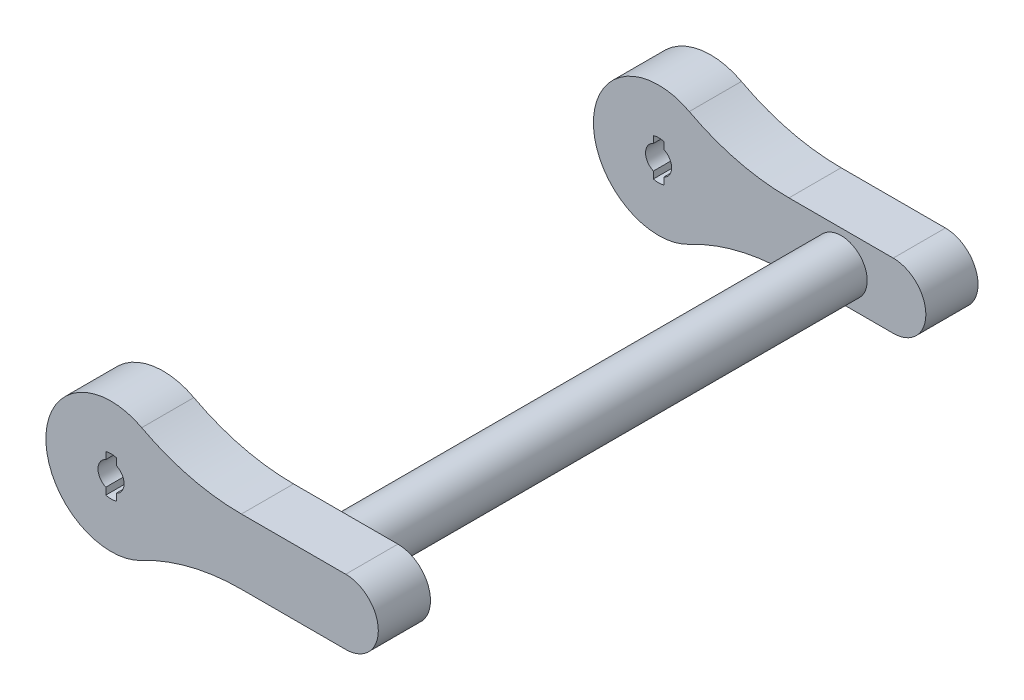
ISO-10303-21;
HEADER;
FILE_DESCRIPTION(('STEP AP214'),'2;1');
FILE_NAME('part.step','',(''),(''),'','','');
FILE_SCHEMA(('AUTOMOTIVE_DESIGN { 1 0 10303 214 1 1 1 1 }'));
ENDSEC;
DATA;
#1=APPLICATION_CONTEXT('core data for automotive mechanical design processes');
#2=APPLICATION_PROTOCOL_DEFINITION('international standard','automotive_design',2000,#1);
#3=PRODUCT_CONTEXT('',#1,'mechanical');
#4=PRODUCT('Part','Part','',(#3));
#5=PRODUCT_RELATED_PRODUCT_CATEGORY('part','',(#4));
#6=PRODUCT_DEFINITION_FORMATION('','',#4);
#7=PRODUCT_DEFINITION_CONTEXT('part definition',#1,'design');
#8=PRODUCT_DEFINITION('design','',#6,#7);
#9=PRODUCT_DEFINITION_SHAPE('','',#8);
#10=(LENGTH_UNIT() NAMED_UNIT(*) SI_UNIT(.MILLI.,.METRE.));
#11=(NAMED_UNIT(*) PLANE_ANGLE_UNIT() SI_UNIT($,.RADIAN.));
#12=(NAMED_UNIT(*) SI_UNIT($,.STERADIAN.) SOLID_ANGLE_UNIT());
#13=UNCERTAINTY_MEASURE_WITH_UNIT(LENGTH_MEASURE(1.E-05),#10,'distance_accuracy_value','');
#14=(GEOMETRIC_REPRESENTATION_CONTEXT(3) GLOBAL_UNCERTAINTY_ASSIGNED_CONTEXT((#13)) GLOBAL_UNIT_ASSIGNED_CONTEXT((#10,
#11,#12)) REPRESENTATION_CONTEXT('',''));
#15=CARTESIAN_POINT('',(0.,0.,0.));
#16=DIRECTION('',(0.,0.,1.));
#17=DIRECTION('',(1.,0.,0.));
#18=AXIS2_PLACEMENT_3D('',#15,#16,#17);
#19=CARTESIAN_POINT('',(0.,0.,-14.142135623731));
#20=DIRECTION('',(0.,0.,1.));
#21=DIRECTION('',(1.,0.,0.));
#22=AXIS2_PLACEMENT_3D('',#19,#20,#21);
#23=CYLINDRICAL_SURFACE('',#22,5.);
#24=CARTESIAN_POINT('',(0.,0.,20.));
#25=DIRECTION('',(0.,0.,1.));
#26=DIRECTION('',(1.,0.,0.));
#27=AXIS2_PLACEMENT_3D('',#24,#25,#26);
#28=CIRCLE('',#27,5.);
#29=CARTESIAN_POINT('',(2.,-4.58257569495584,20.));
#30=VERTEX_POINT('',#29);
#31=CARTESIAN_POINT('',(2.,4.58257569495584,20.));
#32=VERTEX_POINT('',#31);
#33=EDGE_CURVE('E430',#30,#32,#28,.T.);
#34=ORIENTED_EDGE('',*,*,#33,.T.);
#35=DIRECTION('',(0.,0.,1.));
#36=VECTOR('',#35,1.);
#37=CARTESIAN_POINT('',(2.,4.58257569495584,-14.142135623731));
#38=LINE('',#37,#36);
#39=CARTESIAN_POINT('',(2.,4.58257569495584,0.));
#40=VERTEX_POINT('',#39);
#41=EDGE_CURVE('E11',#32,#40,#38,.F.);
#42=ORIENTED_EDGE('',*,*,#41,.T.);
#43=CARTESIAN_POINT('',(0.,0.,0.));
#44=DIRECTION('',(0.,0.,1.));
#45=DIRECTION('',(1.,0.,0.));
#46=AXIS2_PLACEMENT_3D('',#43,#44,#45);
#47=CIRCLE('',#46,5.);
#48=CARTESIAN_POINT('',(2.,-4.58257569495584,0.));
#49=VERTEX_POINT('',#48);
#50=EDGE_CURVE('E435',#40,#49,#47,.F.);
#51=ORIENTED_EDGE('',*,*,#50,.T.);
#52=DIRECTION('',(0.,0.,1.));
#53=VECTOR('',#52,1.);
#54=CARTESIAN_POINT('',(2.,-4.58257569495584,-14.142135623731));
#55=LINE('',#54,#53);
#56=EDGE_CURVE('E54',#49,#30,#55,.T.);
#57=ORIENTED_EDGE('',*,*,#56,.T.);
#58=EDGE_LOOP('',(#34,#42,#51,#57));
#59=FACE_BOUND('',#58,.T.);
#60=ADVANCED_FACE('F45',(#59),#23,.F.);
#61=CARTESIAN_POINT('',(50.,-93.7500000000001,20.));
#62=DIRECTION('',(0.,0.,-1.));
#63=DIRECTION('',(-1.,0.,0.));
#64=AXIS2_PLACEMENT_3D('',#61,#62,#63);
#65=CYLINDRICAL_SURFACE('',#64,81.2500000000001);
#66=CARTESIAN_POINT('',(50.,-93.7500000000001,0.));
#67=DIRECTION('',(0.,0.,-1.));
#68=DIRECTION('',(1.,0.,0.));
#69=AXIS2_PLACEMENT_3D('',#66,#67,#68);
#70=CIRCLE('',#69,81.2500000000001);
#71=CARTESIAN_POINT('',(11.7647058823529,-22.0588235294118,0.));
#72=VERTEX_POINT('',#71);
#73=CARTESIAN_POINT('',(50.,-12.5,0.));
#74=VERTEX_POINT('',#73);
#75=EDGE_CURVE('E461',#72,#74,#70,.T.);
#76=ORIENTED_EDGE('',*,*,#75,.T.);
#77=DIRECTION('',(0.,0.,-1.));
#78=VECTOR('',#77,1.);
#79=CARTESIAN_POINT('',(50.,-12.5,20.));
#80=LINE('',#79,#78);
#81=CARTESIAN_POINT('',(50.,-12.5,20.));
#82=VERTEX_POINT('',#81);
#83=EDGE_CURVE('E498',#82,#74,#80,.T.);
#84=ORIENTED_EDGE('',*,*,#83,.F.);
#85=CARTESIAN_POINT('',(50.,-93.7500000000001,20.));
#86=DIRECTION('',(0.,0.,-1.));
#87=DIRECTION('',(1.,0.,0.));
#88=AXIS2_PLACEMENT_3D('',#85,#86,#87);
#89=CIRCLE('',#88,81.2500000000001);
#90=CARTESIAN_POINT('',(11.7647058823529,-22.0588235294118,20.));
#91=VERTEX_POINT('',#90);
#92=EDGE_CURVE('E440',#91,#82,#89,.T.);
#93=ORIENTED_EDGE('',*,*,#92,.F.);
#94=DIRECTION('',(0.,0.,-1.));
#95=VECTOR('',#94,1.);
#96=CARTESIAN_POINT('',(11.7647058823529,-22.0588235294118,20.));
#97=LINE('',#96,#95);
#98=EDGE_CURVE('E460',#91,#72,#97,.T.);
#99=ORIENTED_EDGE('',*,*,#98,.T.);
#100=EDGE_LOOP('',(#76,#84,#93,#99));
#101=FACE_BOUND('',#100,.T.);
#102=ADVANCED_FACE('F47',(#101),#65,.F.);
#103=CARTESIAN_POINT('',(90.,-12.5,20.));
#104=DIRECTION('',(0.,1.,0.));
#105=DIRECTION('',(-1.,0.,0.));
#106=AXIS2_PLACEMENT_3D('',#103,#104,#105);
#107=PLANE('',#106);
#108=DIRECTION('',(1.,0.,0.));
#109=VECTOR('',#108,1.);
#110=CARTESIAN_POINT('',(90.,-12.5,0.));
#111=LINE('',#110,#109);
#112=CARTESIAN_POINT('',(90.,-12.5,0.));
#113=VERTEX_POINT('',#112);
#114=EDGE_CURVE('E465',#74,#113,#111,.T.);
#115=ORIENTED_EDGE('',*,*,#114,.T.);
#116=DIRECTION('',(0.,0.,-1.));
#117=VECTOR('',#116,1.);
#118=CARTESIAN_POINT('',(90.,-12.5,20.));
#119=LINE('',#118,#117);
#120=CARTESIAN_POINT('',(90.,-12.5,20.));
#121=VERTEX_POINT('',#120);
#122=EDGE_CURVE('E494',#121,#113,#119,.T.);
#123=ORIENTED_EDGE('',*,*,#122,.F.);
#124=DIRECTION('',(1.,0.,0.));
#125=VECTOR('',#124,1.);
#126=CARTESIAN_POINT('',(90.,-12.5,20.));
#127=LINE('',#126,#125);
#128=EDGE_CURVE('E444',#82,#121,#127,.T.);
#129=ORIENTED_EDGE('',*,*,#128,.F.);
#130=ORIENTED_EDGE('',*,*,#83,.T.);
#131=EDGE_LOOP('',(#115,#123,#129,#130));
#132=FACE_BOUND('',#131,.T.);
#133=ADVANCED_FACE('F584',(#132),#107,.F.);
#134=CARTESIAN_POINT('',(90.,0.,20.));
#135=DIRECTION('',(0.,0.,-1.));
#136=DIRECTION('',(-1.,0.,0.));
#137=AXIS2_PLACEMENT_3D('',#134,#135,#136);
#138=CYLINDRICAL_SURFACE('',#137,12.5);
#139=CARTESIAN_POINT('',(90.,0.,0.));
#140=DIRECTION('',(0.,0.,1.));
#141=DIRECTION('',(1.,0.,0.));
#142=AXIS2_PLACEMENT_3D('',#139,#140,#141);
#143=CIRCLE('',#142,12.5);
#144=CARTESIAN_POINT('',(90.,12.5,0.));
#145=VERTEX_POINT('',#144);
#146=EDGE_CURVE('E468',#113,#145,#143,.T.);
#147=ORIENTED_EDGE('',*,*,#146,.T.);
#148=DIRECTION('',(0.,0.,-1.));
#149=VECTOR('',#148,1.);
#150=CARTESIAN_POINT('',(90.,12.5,20.));
#151=LINE('',#150,#149);
#152=CARTESIAN_POINT('',(90.,12.5,20.));
#153=VERTEX_POINT('',#152);
#154=EDGE_CURVE('E490',#153,#145,#151,.T.);
#155=ORIENTED_EDGE('',*,*,#154,.F.);
#156=CARTESIAN_POINT('',(90.,0.,20.));
#157=DIRECTION('',(0.,0.,1.));
#158=DIRECTION('',(1.,0.,0.));
#159=AXIS2_PLACEMENT_3D('',#156,#157,#158);
#160=CIRCLE('',#159,12.5);
#161=EDGE_CURVE('E448',#121,#153,#160,.T.);
#162=ORIENTED_EDGE('',*,*,#161,.F.);
#163=ORIENTED_EDGE('',*,*,#122,.T.);
#164=EDGE_LOOP('',(#147,#155,#162,#163));
#165=FACE_BOUND('',#164,.T.);
#166=ADVANCED_FACE('F789',(#165),#138,.T.);
#167=CARTESIAN_POINT('',(90.,12.5,20.));
#168=DIRECTION('',(0.,-1.,0.));
#169=DIRECTION('',(1.,0.,0.));
#170=AXIS2_PLACEMENT_3D('',#167,#168,#169);
#171=PLANE('',#170);
#172=DIRECTION('',(-1.,0.,0.));
#173=VECTOR('',#172,1.);
#174=CARTESIAN_POINT('',(90.,12.5,0.));
#175=LINE('',#174,#173);
#176=CARTESIAN_POINT('',(50.,12.5,0.));
#177=VERTEX_POINT('',#176);
#178=EDGE_CURVE('E471',#145,#177,#175,.T.);
#179=ORIENTED_EDGE('',*,*,#178,.T.);
#180=DIRECTION('',(0.,0.,-1.));
#181=VECTOR('',#180,1.);
#182=CARTESIAN_POINT('',(50.,12.5,20.));
#183=LINE('',#182,#181);
#184=CARTESIAN_POINT('',(50.,12.5,20.));
#185=VERTEX_POINT('',#184);
#186=EDGE_CURVE('E486',#185,#177,#183,.T.);
#187=ORIENTED_EDGE('',*,*,#186,.F.);
#188=DIRECTION('',(-1.,0.,0.));
#189=VECTOR('',#188,1.);
#190=CARTESIAN_POINT('',(90.,12.5,20.));
#191=LINE('',#190,#189);
#192=EDGE_CURVE('E451',#153,#185,#191,.T.);
#193=ORIENTED_EDGE('',*,*,#192,.F.);
#194=ORIENTED_EDGE('',*,*,#154,.T.);
#195=EDGE_LOOP('',(#179,#187,#193,#194));
#196=FACE_BOUND('',#195,.T.);
#197=ADVANCED_FACE('F798',(#196),#171,.F.);
#198=CARTESIAN_POINT('',(50.,93.7500000000001,20.));
#199=DIRECTION('',(0.,0.,-1.));
#200=DIRECTION('',(-1.,0.,0.));
#201=AXIS2_PLACEMENT_3D('',#198,#199,#200);
#202=CYLINDRICAL_SURFACE('',#201,81.2500000000001);
#203=CARTESIAN_POINT('',(50.,93.7500000000001,0.));
#204=DIRECTION('',(0.,0.,-1.));
#205=DIRECTION('',(-1.,0.,0.));
#206=AXIS2_PLACEMENT_3D('',#203,#204,#205);
#207=CIRCLE('',#206,81.2500000000001);
#208=CARTESIAN_POINT('',(11.7647058823529,22.0588235294118,0.));
#209=VERTEX_POINT('',#208);
#210=EDGE_CURVE('E474',#177,#209,#207,.T.);
#211=ORIENTED_EDGE('',*,*,#210,.T.);
#212=DIRECTION('',(0.,0.,-1.));
#213=VECTOR('',#212,1.);
#214=CARTESIAN_POINT('',(11.7647058823529,22.0588235294118,20.));
#215=LINE('',#214,#213);
#216=CARTESIAN_POINT('',(11.7647058823529,22.0588235294118,20.));
#217=VERTEX_POINT('',#216);
#218=EDGE_CURVE('E482',#217,#209,#215,.T.);
#219=ORIENTED_EDGE('',*,*,#218,.F.);
#220=CARTESIAN_POINT('',(50.,93.7500000000001,20.));
#221=DIRECTION('',(0.,0.,-1.));
#222=DIRECTION('',(-1.,0.,0.));
#223=AXIS2_PLACEMENT_3D('',#220,#221,#222);
#224=CIRCLE('',#223,81.2500000000001);
#225=EDGE_CURVE('E454',#185,#217,#224,.T.);
#226=ORIENTED_EDGE('',*,*,#225,.F.);
#227=ORIENTED_EDGE('',*,*,#186,.T.);
#228=EDGE_LOOP('',(#211,#219,#226,#227));
#229=FACE_BOUND('',#228,.T.);
#230=ADVANCED_FACE('F808',(#229),#202,.F.);
#231=CARTESIAN_POINT('',(0.,0.,20.));
#232=DIRECTION('',(0.,0.,-1.));
#233=DIRECTION('',(-1.,0.,0.));
#234=AXIS2_PLACEMENT_3D('',#231,#232,#233);
#235=CYLINDRICAL_SURFACE('',#234,25.);
#236=CARTESIAN_POINT('',(0.,0.,0.));
#237=DIRECTION('',(0.,0.,1.));
#238=DIRECTION('',(1.,0.,0.));
#239=AXIS2_PLACEMENT_3D('',#236,#237,#238);
#240=CIRCLE('',#239,25.);
#241=EDGE_CURVE('E445',#209,#72,#240,.T.);
#242=ORIENTED_EDGE('',*,*,#241,.T.);
#243=ORIENTED_EDGE('',*,*,#98,.F.);
#244=CARTESIAN_POINT('',(0.,0.,20.));
#245=DIRECTION('',(0.,0.,1.));
#246=DIRECTION('',(1.,0.,0.));
#247=AXIS2_PLACEMENT_3D('',#244,#245,#246);
#248=CIRCLE('',#247,25.);
#249=EDGE_CURVE('E457',#217,#91,#248,.T.);
#250=ORIENTED_EDGE('',*,*,#249,.F.);
#251=ORIENTED_EDGE('',*,*,#218,.T.);
#252=EDGE_LOOP('',(#242,#243,#250,#251));
#253=FACE_BOUND('',#252,.T.);
#254=ADVANCED_FACE('F818',(#253),#235,.T.);
#255=CARTESIAN_POINT('',(50.,-93.7500000000001,20.));
#256=DIRECTION('',(0.,0.,1.));
#257=DIRECTION('',(1.,0.,0.));
#258=AXIS2_PLACEMENT_3D('',#255,#256,#257);
#259=PLANE('',#258);
#260=CARTESIAN_POINT('',(70.,0.,20.));
#261=DIRECTION('',(0.,0.,1.));
#262=DIRECTION('',(1.,0.,0.));
#263=AXIS2_PLACEMENT_3D('',#260,#261,#262);
#264=CIRCLE('',#263,9.99999999999999);
#265=CARTESIAN_POINT('',(80.,0.,20.));
#266=VERTEX_POINT('',#265);
#267=EDGE_CURVE('E384',#266,#266,#264,.T.);
#268=ORIENTED_EDGE('',*,*,#267,.F.);
#269=EDGE_LOOP('',(#268));
#270=FACE_BOUND('',#269,.T.);
#271=DIRECTION('',(0.,1.,0.));
#272=VECTOR('',#271,1.);
#273=CARTESIAN_POINT('',(2.,-7.22841614740048,20.));
#274=LINE('',#273,#272);
#275=CARTESIAN_POINT('',(2.,7.22841614740048,20.));
#276=VERTEX_POINT('',#275);
#277=EDGE_CURVE('E411',#32,#276,#274,.T.);
#278=ORIENTED_EDGE('',*,*,#277,.F.);
#279=ORIENTED_EDGE('',*,*,#33,.F.);
#280=CARTESIAN_POINT('',(2.,-7.22841614740048,20.));
#281=VERTEX_POINT('',#280);
#282=EDGE_CURVE('E412',#281,#30,#274,.T.);
#283=ORIENTED_EDGE('',*,*,#282,.F.);
#284=CARTESIAN_POINT('',(0.,0.,20.));
#285=DIRECTION('',(0.,0.,1.));
#286=DIRECTION('',(1.,0.,0.));
#287=AXIS2_PLACEMENT_3D('',#284,#285,#286);
#288=CIRCLE('',#287,7.5);
#289=CARTESIAN_POINT('',(-2.,-7.22841614740048,20.));
#290=VERTEX_POINT('',#289);
#291=EDGE_CURVE('E407',#290,#281,#288,.T.);
#292=ORIENTED_EDGE('',*,*,#291,.F.);
#293=DIRECTION('',(0.,-1.,0.));
#294=VECTOR('',#293,1.);
#295=CARTESIAN_POINT('',(-2.,7.22841614740048,20.));
#296=LINE('',#295,#294);
#297=CARTESIAN_POINT('',(-2.,-4.58257569495584,20.));
#298=VERTEX_POINT('',#297);
#299=EDGE_CURVE('E404',#298,#290,#296,.T.);
#300=ORIENTED_EDGE('',*,*,#299,.F.);
#301=CARTESIAN_POINT('',(-2.,4.58257569495584,20.));
#302=VERTEX_POINT('',#301);
#303=EDGE_CURVE('E434',#302,#298,#28,.T.);
#304=ORIENTED_EDGE('',*,*,#303,.F.);
#305=CARTESIAN_POINT('',(-2.,7.22841614740048,20.));
#306=VERTEX_POINT('',#305);
#307=EDGE_CURVE('E61',#306,#302,#296,.T.);
#308=ORIENTED_EDGE('',*,*,#307,.F.);
#309=CARTESIAN_POINT('',(0.,0.,20.));
#310=DIRECTION('',(0.,0.,1.));
#311=DIRECTION('',(1.,0.,0.));
#312=AXIS2_PLACEMENT_3D('',#309,#310,#311);
#313=CIRCLE('',#312,7.5);
#314=EDGE_CURVE('E388',#276,#306,#313,.T.);
#315=ORIENTED_EDGE('',*,*,#314,.F.);
#316=EDGE_LOOP('',(#278,#279,#283,#292,#300,#304,#308,#315));
#317=FACE_BOUND('',#316,.T.);
#318=ORIENTED_EDGE('',*,*,#92,.T.);
#319=ORIENTED_EDGE('',*,*,#128,.T.);
#320=ORIENTED_EDGE('',*,*,#161,.T.);
#321=ORIENTED_EDGE('',*,*,#192,.T.);
#322=ORIENTED_EDGE('',*,*,#225,.T.);
#323=ORIENTED_EDGE('',*,*,#249,.T.);
#324=EDGE_LOOP('',(#318,#319,#320,#321,#322,#323));
#325=FACE_BOUND('',#324,.T.);
#326=ADVANCED_FACE('F517',(#270,#317,#325),#259,.T.);
#327=CARTESIAN_POINT('',(50.,-93.7500000000001,0.));
#328=DIRECTION('',(0.,0.,1.));
#329=DIRECTION('',(1.,0.,0.));
#330=AXIS2_PLACEMENT_3D('',#327,#328,#329);
#331=PLANE('',#330);
#332=ORIENTED_EDGE('',*,*,#50,.F.);
#333=DIRECTION('',(0.,-1.,0.));
#334=VECTOR('',#333,1.);
#335=CARTESIAN_POINT('',(2.,-7.22841614740048,0.));
#336=LINE('',#335,#334);
#337=CARTESIAN_POINT('',(2.,7.22841614740048,0.));
#338=VERTEX_POINT('',#337);
#339=EDGE_CURVE('E394',#338,#40,#336,.T.);
#340=ORIENTED_EDGE('',*,*,#339,.F.);
#341=CARTESIAN_POINT('',(0.,0.,0.));
#342=DIRECTION('',(0.,0.,1.));
#343=DIRECTION('',(1.,0.,0.));
#344=AXIS2_PLACEMENT_3D('',#341,#342,#343);
#345=CIRCLE('',#344,7.5);
#346=CARTESIAN_POINT('',(-2.,7.22841614740048,0.));
#347=VERTEX_POINT('',#346);
#348=EDGE_CURVE('E397',#347,#338,#345,.F.);
#349=ORIENTED_EDGE('',*,*,#348,.F.);
#350=DIRECTION('',(0.,1.,0.));
#351=VECTOR('',#350,1.);
#352=CARTESIAN_POINT('',(-2.,7.22841614740048,0.));
#353=LINE('',#352,#351);
#354=CARTESIAN_POINT('',(-2.,4.58257569495584,0.));
#355=VERTEX_POINT('',#354);
#356=EDGE_CURVE('E400',#355,#347,#353,.T.);
#357=ORIENTED_EDGE('',*,*,#356,.F.);
#358=CARTESIAN_POINT('',(-2.,-4.58257569495584,0.));
#359=VERTEX_POINT('',#358);
#360=EDGE_CURVE('E439',#359,#355,#47,.F.);
#361=ORIENTED_EDGE('',*,*,#360,.F.);
#362=CARTESIAN_POINT('',(-2.,-7.22841614740048,0.));
#363=VERTEX_POINT('',#362);
#364=EDGE_CURVE('E69',#363,#359,#353,.T.);
#365=ORIENTED_EDGE('',*,*,#364,.F.);
#366=CARTESIAN_POINT('',(0.,0.,0.));
#367=DIRECTION('',(0.,0.,1.));
#368=DIRECTION('',(1.,0.,0.));
#369=AXIS2_PLACEMENT_3D('',#366,#367,#368);
#370=CIRCLE('',#369,7.5);
#371=CARTESIAN_POINT('',(2.,-7.22841614740048,0.));
#372=VERTEX_POINT('',#371);
#373=EDGE_CURVE('E389',#372,#363,#370,.F.);
#374=ORIENTED_EDGE('',*,*,#373,.F.);
#375=EDGE_CURVE('E392',#49,#372,#336,.T.);
#376=ORIENTED_EDGE('',*,*,#375,.F.);
#377=EDGE_LOOP('',(#332,#340,#349,#357,#361,#365,#374,#376));
#378=FACE_BOUND('',#377,.T.);
#379=ORIENTED_EDGE('',*,*,#75,.F.);
#380=ORIENTED_EDGE('',*,*,#241,.F.);
#381=ORIENTED_EDGE('',*,*,#210,.F.);
#382=ORIENTED_EDGE('',*,*,#178,.F.);
#383=ORIENTED_EDGE('',*,*,#146,.F.);
#384=ORIENTED_EDGE('',*,*,#114,.F.);
#385=EDGE_LOOP('',(#379,#380,#381,#382,#383,#384));
#386=FACE_BOUND('',#385,.T.);
#387=ADVANCED_FACE('F590',(#378,#386),#331,.F.);
#388=ORIENTED_EDGE('',*,*,#303,.T.);
#389=DIRECTION('',(0.,0.,1.));
#390=VECTOR('',#389,1.);
#391=CARTESIAN_POINT('',(-2.,-4.58257569495584,-14.142135623731));
#392=LINE('',#391,#390);
#393=EDGE_CURVE('E505',#298,#359,#392,.F.);
#394=ORIENTED_EDGE('',*,*,#393,.T.);
#395=ORIENTED_EDGE('',*,*,#360,.T.);
#396=DIRECTION('',(0.,0.,1.));
#397=VECTOR('',#396,1.);
#398=CARTESIAN_POINT('',(-2.,4.58257569495584,-14.142135623731));
#399=LINE('',#398,#397);
#400=EDGE_CURVE('E502',#355,#302,#399,.T.);
#401=ORIENTED_EDGE('',*,*,#400,.T.);
#402=EDGE_LOOP('',(#388,#394,#395,#401));
#403=FACE_BOUND('',#402,.T.);
#404=ADVANCED_FACE('F577',(#403),#23,.F.);
#405=CARTESIAN_POINT('',(2.,-7.22841614740048,-15.52417469626));
#406=DIRECTION('',(1.,0.,0.));
#407=DIRECTION('',(0.,0.,-1.));
#408=AXIS2_PLACEMENT_3D('',#405,#406,#407);
#409=PLANE('',#408);
#410=ORIENTED_EDGE('',*,*,#277,.T.);
#411=DIRECTION('',(0.,0.,1.));
#412=VECTOR('',#411,1.);
#413=CARTESIAN_POINT('',(2.,7.22841614740048,-15.52417469626));
#414=LINE('',#413,#412);
#415=EDGE_CURVE('E393',#338,#276,#414,.T.);
#416=ORIENTED_EDGE('',*,*,#415,.F.);
#417=ORIENTED_EDGE('',*,*,#339,.T.);
#418=ORIENTED_EDGE('',*,*,#41,.F.);
#419=EDGE_LOOP('',(#410,#416,#417,#418));
#420=FACE_BOUND('',#419,.T.);
#421=ADVANCED_FACE('F589',(#420),#409,.F.);
#422=CARTESIAN_POINT('',(-2.,7.22841614740048,-15.52417469626));
#423=DIRECTION('',(-1.,0.,0.));
#424=DIRECTION('',(0.,0.,1.));
#425=AXIS2_PLACEMENT_3D('',#422,#423,#424);
#426=PLANE('',#425);
#427=ORIENTED_EDGE('',*,*,#356,.T.);
#428=DIRECTION('',(0.,0.,1.));
#429=VECTOR('',#428,1.);
#430=CARTESIAN_POINT('',(-2.,7.22841614740048,-15.52417469626));
#431=LINE('',#430,#429);
#432=EDGE_CURVE('E415',#347,#306,#431,.T.);
#433=ORIENTED_EDGE('',*,*,#432,.T.);
#434=ORIENTED_EDGE('',*,*,#307,.T.);
#435=ORIENTED_EDGE('',*,*,#400,.F.);
#436=EDGE_LOOP('',(#427,#433,#434,#435));
#437=FACE_BOUND('',#436,.T.);
#438=ADVANCED_FACE('F596',(#437),#426,.F.);
#439=CARTESIAN_POINT('',(0.,0.,-15.52417469626));
#440=DIRECTION('',(0.,0.,1.));
#441=DIRECTION('',(1.,0.,0.));
#442=AXIS2_PLACEMENT_3D('',#439,#440,#441);
#443=CYLINDRICAL_SURFACE('',#442,7.5);
#444=ORIENTED_EDGE('',*,*,#348,.T.);
#445=ORIENTED_EDGE('',*,*,#415,.T.);
#446=ORIENTED_EDGE('',*,*,#314,.T.);
#447=ORIENTED_EDGE('',*,*,#432,.F.);
#448=EDGE_LOOP('',(#444,#445,#446,#447));
#449=FACE_BOUND('',#448,.T.);
#450=ADVANCED_FACE('F620',(#449),#443,.F.);
#451=ORIENTED_EDGE('',*,*,#375,.T.);
#452=DIRECTION('',(0.,0.,1.));
#453=VECTOR('',#452,1.);
#454=CARTESIAN_POINT('',(2.,-7.22841614740048,-15.52417469626));
#455=LINE('',#454,#453);
#456=EDGE_CURVE('E419',#372,#281,#455,.T.);
#457=ORIENTED_EDGE('',*,*,#456,.T.);
#458=ORIENTED_EDGE('',*,*,#282,.T.);
#459=ORIENTED_EDGE('',*,*,#56,.F.);
#460=EDGE_LOOP('',(#451,#457,#458,#459));
#461=FACE_BOUND('',#460,.T.);
#462=ADVANCED_FACE('F598',(#461),#409,.F.);
#463=ORIENTED_EDGE('',*,*,#299,.T.);
#464=DIRECTION('',(0.,0.,1.));
#465=VECTOR('',#464,1.);
#466=CARTESIAN_POINT('',(-2.,-7.22841614740048,-15.52417469626));
#467=LINE('',#466,#465);
#468=EDGE_CURVE('E422',#363,#290,#467,.T.);
#469=ORIENTED_EDGE('',*,*,#468,.F.);
#470=ORIENTED_EDGE('',*,*,#364,.T.);
#471=ORIENTED_EDGE('',*,*,#393,.F.);
#472=EDGE_LOOP('',(#463,#469,#470,#471));
#473=FACE_BOUND('',#472,.T.);
#474=ADVANCED_FACE('F626',(#473),#426,.F.);
#475=CARTESIAN_POINT('',(0.,0.,-15.52417469626));
#476=DIRECTION('',(0.,0.,1.));
#477=DIRECTION('',(1.,0.,0.));
#478=AXIS2_PLACEMENT_3D('',#475,#476,#477);
#479=CYLINDRICAL_SURFACE('',#478,7.5);
#480=ORIENTED_EDGE('',*,*,#373,.T.);
#481=ORIENTED_EDGE('',*,*,#468,.T.);
#482=ORIENTED_EDGE('',*,*,#291,.T.);
#483=ORIENTED_EDGE('',*,*,#456,.F.);
#484=EDGE_LOOP('',(#480,#481,#482,#483));
#485=FACE_BOUND('',#484,.T.);
#486=ADVANCED_FACE('F613',(#485),#479,.F.);
#487=CARTESIAN_POINT('',(70.,0.,115.));
#488=DIRECTION('',(0.,0.,-1.));
#489=DIRECTION('',(-1.,0.,0.));
#490=AXIS2_PLACEMENT_3D('',#487,#488,#489);
#491=CYLINDRICAL_SURFACE('',#490,9.99999999999999);
#492=ORIENTED_EDGE('',*,*,#267,.T.);
#493=EDGE_LOOP('',(#492));
#494=FACE_BOUND('',#493,.T.);
#495=CARTESIAN_POINT('',(70.,0.,210.));
#496=DIRECTION('',(0.,0.,1.));
#497=DIRECTION('',(1.,0.,0.));
#498=AXIS2_PLACEMENT_3D('',#495,#496,#497);
#499=CIRCLE('',#498,9.99999999999999);
#500=CARTESIAN_POINT('',(80.,0.,210.));
#501=VERTEX_POINT('',#500);
#502=EDGE_CURVE('E263',#501,#501,#499,.T.);
#503=ORIENTED_EDGE('',*,*,#502,.F.);
#504=EDGE_LOOP('',(#503));
#505=FACE_BOUND('',#504,.T.);
#506=ADVANCED_FACE('F631',(#494,#505),#491,.T.);
#507=CARTESIAN_POINT('',(0.,0.,244.142135623731));
#508=DIRECTION('',(0.,0.,-1.));
#509=DIRECTION('',(1.,0.,0.));
#510=AXIS2_PLACEMENT_3D('',#507,#508,#509);
#511=CYLINDRICAL_SURFACE('',#510,5.);
#512=CARTESIAN_POINT('',(0.,0.,210.));
#513=DIRECTION('',(0.,0.,1.));
#514=DIRECTION('',(1.,0.,0.));
#515=AXIS2_PLACEMENT_3D('',#512,#513,#514);
#516=CIRCLE('',#515,5.);
#517=CARTESIAN_POINT('',(2.,-4.58257569495584,210.));
#518=VERTEX_POINT('',#517);
#519=CARTESIAN_POINT('',(2.,4.58257569495584,210.));
#520=VERTEX_POINT('',#519);
#521=EDGE_CURVE('E291',#518,#520,#516,.T.);
#522=ORIENTED_EDGE('',*,*,#521,.F.);
#523=DIRECTION('',(0.,0.,-1.));
#524=VECTOR('',#523,1.);
#525=CARTESIAN_POINT('',(2.,-4.58257569495584,244.142135623731));
#526=LINE('',#525,#524);
#527=CARTESIAN_POINT('',(2.,-4.58257569495584,230.));
#528=VERTEX_POINT('',#527);
#529=EDGE_CURVE('E376',#528,#518,#526,.T.);
#530=ORIENTED_EDGE('',*,*,#529,.F.);
#531=CARTESIAN_POINT('',(0.,0.,230.));
#532=DIRECTION('',(0.,0.,1.));
#533=DIRECTION('',(1.,0.,0.));
#534=AXIS2_PLACEMENT_3D('',#531,#532,#533);
#535=CIRCLE('',#534,5.);
#536=CARTESIAN_POINT('',(2.,4.58257569495584,230.));
#537=VERTEX_POINT('',#536);
#538=EDGE_CURVE('E296',#537,#528,#535,.F.);
#539=ORIENTED_EDGE('',*,*,#538,.F.);
#540=DIRECTION('',(0.,0.,-1.));
#541=VECTOR('',#540,1.);
#542=CARTESIAN_POINT('',(2.,4.58257569495584,244.142135623731));
#543=LINE('',#542,#541);
#544=EDGE_CURVE('E380',#520,#537,#543,.F.);
#545=ORIENTED_EDGE('',*,*,#544,.F.);
#546=EDGE_LOOP('',(#522,#530,#539,#545));
#547=FACE_BOUND('',#546,.T.);
#548=ADVANCED_FACE('F562',(#547),#511,.F.);
#549=CARTESIAN_POINT('',(50.,-93.7500000000001,210.));
#550=DIRECTION('',(0.,0.,1.));
#551=DIRECTION('',(-1.,0.,0.));
#552=AXIS2_PLACEMENT_3D('',#549,#550,#551);
#553=CYLINDRICAL_SURFACE('',#552,81.2500000000001);
#554=CARTESIAN_POINT('',(50.,-93.7500000000001,230.));
#555=DIRECTION('',(0.,0.,-1.));
#556=DIRECTION('',(1.,0.,0.));
#557=AXIS2_PLACEMENT_3D('',#554,#555,#556);
#558=CIRCLE('',#557,81.2500000000001);
#559=CARTESIAN_POINT('',(11.7647058823529,-22.0588235294118,230.));
#560=VERTEX_POINT('',#559);
#561=CARTESIAN_POINT('',(50.,-12.5,230.));
#562=VERTEX_POINT('',#561);
#563=EDGE_CURVE('E326',#560,#562,#558,.T.);
#564=ORIENTED_EDGE('',*,*,#563,.F.);
#565=DIRECTION('',(0.,0.,1.));
#566=VECTOR('',#565,1.);
#567=CARTESIAN_POINT('',(11.7647058823529,-22.0588235294118,210.));
#568=LINE('',#567,#566);
#569=CARTESIAN_POINT('',(11.7647058823529,-22.0588235294118,210.));
#570=VERTEX_POINT('',#569);
#571=EDGE_CURVE('E325',#570,#560,#568,.T.);
#572=ORIENTED_EDGE('',*,*,#571,.F.);
#573=CARTESIAN_POINT('',(50.,-93.7500000000001,210.));
#574=DIRECTION('',(0.,0.,-1.));
#575=DIRECTION('',(1.,0.,0.));
#576=AXIS2_PLACEMENT_3D('',#573,#574,#575);
#577=CIRCLE('',#576,81.2500000000001);
#578=CARTESIAN_POINT('',(50.,-12.5,210.));
#579=VERTEX_POINT('',#578);
#580=EDGE_CURVE('E301',#570,#579,#577,.T.);
#581=ORIENTED_EDGE('',*,*,#580,.T.);
#582=DIRECTION('',(0.,0.,1.));
#583=VECTOR('',#582,1.);
#584=CARTESIAN_POINT('',(50.,-12.5,210.));
#585=LINE('',#584,#583);
#586=EDGE_CURVE('E367',#579,#562,#585,.T.);
#587=ORIENTED_EDGE('',*,*,#586,.T.);
#588=EDGE_LOOP('',(#564,#572,#581,#587));
#589=FACE_BOUND('',#588,.T.);
#590=ADVANCED_FACE('F636',(#589),#553,.F.);
#591=CARTESIAN_POINT('',(90.,-12.5,210.));
#592=DIRECTION('',(0.,1.,0.));
#593=DIRECTION('',(-1.,0.,0.));
#594=AXIS2_PLACEMENT_3D('',#591,#592,#593);
#595=PLANE('',#594);
#596=DIRECTION('',(1.,0.,0.));
#597=VECTOR('',#596,1.);
#598=CARTESIAN_POINT('',(90.,-12.5,230.));
#599=LINE('',#598,#597);
#600=CARTESIAN_POINT('',(90.,-12.5,230.));
#601=VERTEX_POINT('',#600);
#602=EDGE_CURVE('E330',#562,#601,#599,.T.);
#603=ORIENTED_EDGE('',*,*,#602,.F.);
#604=ORIENTED_EDGE('',*,*,#586,.F.);
#605=DIRECTION('',(1.,0.,0.));
#606=VECTOR('',#605,1.);
#607=CARTESIAN_POINT('',(90.,-12.5,210.));
#608=LINE('',#607,#606);
#609=CARTESIAN_POINT('',(90.,-12.5,210.));
#610=VERTEX_POINT('',#609);
#611=EDGE_CURVE('E305',#579,#610,#608,.T.);
#612=ORIENTED_EDGE('',*,*,#611,.T.);
#613=DIRECTION('',(0.,0.,1.));
#614=VECTOR('',#613,1.);
#615=CARTESIAN_POINT('',(90.,-12.5,210.));
#616=LINE('',#615,#614);
#617=EDGE_CURVE('E363',#610,#601,#616,.T.);
#618=ORIENTED_EDGE('',*,*,#617,.T.);
#619=EDGE_LOOP('',(#603,#604,#612,#618));
#620=FACE_BOUND('',#619,.T.);
#621=ADVANCED_FACE('F639',(#620),#595,.F.);
#622=CARTESIAN_POINT('',(90.,0.,210.));
#623=DIRECTION('',(0.,0.,1.));
#624=DIRECTION('',(-1.,0.,0.));
#625=AXIS2_PLACEMENT_3D('',#622,#623,#624);
#626=CYLINDRICAL_SURFACE('',#625,12.5);
#627=CARTESIAN_POINT('',(90.,0.,230.));
#628=DIRECTION('',(0.,0.,1.));
#629=DIRECTION('',(1.,0.,0.));
#630=AXIS2_PLACEMENT_3D('',#627,#628,#629);
#631=CIRCLE('',#630,12.5);
#632=CARTESIAN_POINT('',(90.,12.5,230.));
#633=VERTEX_POINT('',#632);
#634=EDGE_CURVE('E334',#601,#633,#631,.T.);
#635=ORIENTED_EDGE('',*,*,#634,.F.);
#636=ORIENTED_EDGE('',*,*,#617,.F.);
#637=CARTESIAN_POINT('',(90.,0.,210.));
#638=DIRECTION('',(0.,0.,1.));
#639=DIRECTION('',(1.,0.,0.));
#640=AXIS2_PLACEMENT_3D('',#637,#638,#639);
#641=CIRCLE('',#640,12.5);
#642=CARTESIAN_POINT('',(90.,12.5,210.));
#643=VERTEX_POINT('',#642);
#644=EDGE_CURVE('E310',#610,#643,#641,.T.);
#645=ORIENTED_EDGE('',*,*,#644,.T.);
#646=DIRECTION('',(0.,0.,1.));
#647=VECTOR('',#646,1.);
#648=CARTESIAN_POINT('',(90.,12.5,210.));
#649=LINE('',#648,#647);
#650=EDGE_CURVE('E359',#643,#633,#649,.T.);
#651=ORIENTED_EDGE('',*,*,#650,.T.);
#652=EDGE_LOOP('',(#635,#636,#645,#651));
#653=FACE_BOUND('',#652,.T.);
#654=ADVANCED_FACE('F643',(#653),#626,.T.);
#655=CARTESIAN_POINT('',(90.,12.5,210.));
#656=DIRECTION('',(0.,-1.,0.));
#657=DIRECTION('',(1.,0.,0.));
#658=AXIS2_PLACEMENT_3D('',#655,#656,#657);
#659=PLANE('',#658);
#660=DIRECTION('',(-1.,0.,0.));
#661=VECTOR('',#660,1.);
#662=CARTESIAN_POINT('',(90.,12.5,230.));
#663=LINE('',#662,#661);
#664=CARTESIAN_POINT('',(50.,12.5,230.));
#665=VERTEX_POINT('',#664);
#666=EDGE_CURVE('E338',#633,#665,#663,.T.);
#667=ORIENTED_EDGE('',*,*,#666,.F.);
#668=ORIENTED_EDGE('',*,*,#650,.F.);
#669=DIRECTION('',(-1.,0.,0.));
#670=VECTOR('',#669,1.);
#671=CARTESIAN_POINT('',(90.,12.5,210.));
#672=LINE('',#671,#670);
#673=CARTESIAN_POINT('',(50.,12.5,210.));
#674=VERTEX_POINT('',#673);
#675=EDGE_CURVE('E314',#643,#674,#672,.T.);
#676=ORIENTED_EDGE('',*,*,#675,.T.);
#677=DIRECTION('',(0.,0.,1.));
#678=VECTOR('',#677,1.);
#679=CARTESIAN_POINT('',(50.,12.5,210.));
#680=LINE('',#679,#678);
#681=EDGE_CURVE('E355',#674,#665,#680,.T.);
#682=ORIENTED_EDGE('',*,*,#681,.T.);
#683=EDGE_LOOP('',(#667,#668,#676,#682));
#684=FACE_BOUND('',#683,.T.);
#685=ADVANCED_FACE('F647',(#684),#659,.F.);
#686=CARTESIAN_POINT('',(50.,93.7500000000001,210.));
#687=DIRECTION('',(0.,0.,1.));
#688=DIRECTION('',(-1.,0.,0.));
#689=AXIS2_PLACEMENT_3D('',#686,#687,#688);
#690=CYLINDRICAL_SURFACE('',#689,81.2500000000001);
#691=CARTESIAN_POINT('',(50.,93.7500000000001,230.));
#692=DIRECTION('',(0.,0.,-1.));
#693=DIRECTION('',(-1.,0.,0.));
#694=AXIS2_PLACEMENT_3D('',#691,#692,#693);
#695=CIRCLE('',#694,81.2500000000001);
#696=CARTESIAN_POINT('',(11.7647058823529,22.0588235294118,230.));
#697=VERTEX_POINT('',#696);
#698=EDGE_CURVE('E342',#665,#697,#695,.T.);
#699=ORIENTED_EDGE('',*,*,#698,.F.);
#700=ORIENTED_EDGE('',*,*,#681,.F.);
#701=CARTESIAN_POINT('',(50.,93.7500000000001,210.));
#702=DIRECTION('',(0.,0.,-1.));
#703=DIRECTION('',(-1.,0.,0.));
#704=AXIS2_PLACEMENT_3D('',#701,#702,#703);
#705=CIRCLE('',#704,81.2500000000001);
#706=CARTESIAN_POINT('',(11.7647058823529,22.0588235294118,210.));
#707=VERTEX_POINT('',#706);
#708=EDGE_CURVE('E318',#674,#707,#705,.T.);
#709=ORIENTED_EDGE('',*,*,#708,.T.);
#710=DIRECTION('',(0.,0.,1.));
#711=VECTOR('',#710,1.);
#712=CARTESIAN_POINT('',(11.7647058823529,22.0588235294118,210.));
#713=LINE('',#712,#711);
#714=EDGE_CURVE('E351',#707,#697,#713,.T.);
#715=ORIENTED_EDGE('',*,*,#714,.T.);
#716=EDGE_LOOP('',(#699,#700,#709,#715));
#717=FACE_BOUND('',#716,.T.);
#718=ADVANCED_FACE('F651',(#717),#690,.F.);
#719=CARTESIAN_POINT('',(0.,0.,210.));
#720=DIRECTION('',(0.,0.,1.));
#721=DIRECTION('',(-1.,0.,0.));
#722=AXIS2_PLACEMENT_3D('',#719,#720,#721);
#723=CYLINDRICAL_SURFACE('',#722,25.);
#724=CARTESIAN_POINT('',(0.,0.,230.));
#725=DIRECTION('',(0.,0.,1.));
#726=DIRECTION('',(1.,0.,0.));
#727=AXIS2_PLACEMENT_3D('',#724,#725,#726);
#728=CIRCLE('',#727,25.);
#729=EDGE_CURVE('E306',#697,#560,#728,.T.);
#730=ORIENTED_EDGE('',*,*,#729,.F.);
#731=ORIENTED_EDGE('',*,*,#714,.F.);
#732=CARTESIAN_POINT('',(0.,0.,210.));
#733=DIRECTION('',(0.,0.,1.));
#734=DIRECTION('',(1.,0.,0.));
#735=AXIS2_PLACEMENT_3D('',#732,#733,#734);
#736=CIRCLE('',#735,25.);
#737=EDGE_CURVE('E322',#707,#570,#736,.T.);
#738=ORIENTED_EDGE('',*,*,#737,.T.);
#739=ORIENTED_EDGE('',*,*,#571,.T.);
#740=EDGE_LOOP('',(#730,#731,#738,#739));
#741=FACE_BOUND('',#740,.T.);
#742=ADVANCED_FACE('F655',(#741),#723,.T.);
#743=CARTESIAN_POINT('',(50.,-93.7500000000001,210.));
#744=DIRECTION('',(0.,0.,-1.));
#745=DIRECTION('',(1.,0.,0.));
#746=AXIS2_PLACEMENT_3D('',#743,#744,#745);
#747=PLANE('',#746);
#748=ORIENTED_EDGE('',*,*,#502,.T.);
#749=EDGE_LOOP('',(#748));
#750=FACE_BOUND('',#749,.T.);
#751=DIRECTION('',(0.,1.,0.));
#752=VECTOR('',#751,1.);
#753=CARTESIAN_POINT('',(2.,-7.22841614740048,210.));
#754=LINE('',#753,#752);
#755=CARTESIAN_POINT('',(2.,7.22841614740048,210.));
#756=VERTEX_POINT('',#755);
#757=EDGE_CURVE('E261',#520,#756,#754,.T.);
#758=ORIENTED_EDGE('',*,*,#757,.T.);
#759=CARTESIAN_POINT('',(0.,0.,210.));
#760=DIRECTION('',(0.,0.,1.));
#761=DIRECTION('',(1.,0.,0.));
#762=AXIS2_PLACEMENT_3D('',#759,#760,#761);
#763=CIRCLE('',#762,7.5);
#764=CARTESIAN_POINT('',(-2.,7.22841614740048,210.));
#765=VERTEX_POINT('',#764);
#766=EDGE_CURVE('E236',#756,#765,#763,.T.);
#767=ORIENTED_EDGE('',*,*,#766,.T.);
#768=DIRECTION('',(0.,-1.,0.));
#769=VECTOR('',#768,1.);
#770=CARTESIAN_POINT('',(-2.,7.22841614740048,210.));
#771=LINE('',#770,#769);
#772=CARTESIAN_POINT('',(-2.,4.58257569495584,210.));
#773=VERTEX_POINT('',#772);
#774=EDGE_CURVE('E248',#765,#773,#771,.T.);
#775=ORIENTED_EDGE('',*,*,#774,.T.);
#776=CARTESIAN_POINT('',(-2.,-4.58257569495584,210.));
#777=VERTEX_POINT('',#776);
#778=EDGE_CURVE('E295',#773,#777,#516,.T.);
#779=ORIENTED_EDGE('',*,*,#778,.T.);
#780=CARTESIAN_POINT('',(-2.,-7.22841614740048,210.));
#781=VERTEX_POINT('',#780);
#782=EDGE_CURVE('E256',#777,#781,#771,.T.);
#783=ORIENTED_EDGE('',*,*,#782,.T.);
#784=CARTESIAN_POINT('',(0.,0.,210.));
#785=DIRECTION('',(0.,0.,1.));
#786=DIRECTION('',(1.,0.,0.));
#787=AXIS2_PLACEMENT_3D('',#784,#785,#786);
#788=CIRCLE('',#787,7.5);
#789=CARTESIAN_POINT('',(2.,-7.22841614740048,210.));
#790=VERTEX_POINT('',#789);
#791=EDGE_CURVE('E255',#781,#790,#788,.T.);
#792=ORIENTED_EDGE('',*,*,#791,.T.);
#793=EDGE_CURVE('E245',#790,#518,#754,.T.);
#794=ORIENTED_EDGE('',*,*,#793,.T.);
#795=ORIENTED_EDGE('',*,*,#521,.T.);
#796=EDGE_LOOP('',(#758,#767,#775,#779,#783,#792,#794,#795));
#797=FACE_BOUND('',#796,.T.);
#798=ORIENTED_EDGE('',*,*,#580,.F.);
#799=ORIENTED_EDGE('',*,*,#737,.F.);
#800=ORIENTED_EDGE('',*,*,#708,.F.);
#801=ORIENTED_EDGE('',*,*,#675,.F.);
#802=ORIENTED_EDGE('',*,*,#644,.F.);
#803=ORIENTED_EDGE('',*,*,#611,.F.);
#804=EDGE_LOOP('',(#798,#799,#800,#801,#802,#803));
#805=FACE_BOUND('',#804,.T.);
#806=ADVANCED_FACE('F258',(#750,#797,#805),#747,.T.);
#807=CARTESIAN_POINT('',(50.,-93.7500000000001,230.));
#808=DIRECTION('',(0.,0.,-1.));
#809=DIRECTION('',(1.,0.,0.));
#810=AXIS2_PLACEMENT_3D('',#807,#808,#809);
#811=PLANE('',#810);
#812=ORIENTED_EDGE('',*,*,#538,.T.);
#813=DIRECTION('',(0.,-1.,0.));
#814=VECTOR('',#813,1.);
#815=CARTESIAN_POINT('',(2.,-7.22841614740048,230.));
#816=LINE('',#815,#814);
#817=CARTESIAN_POINT('',(2.,-7.22841614740048,230.));
#818=VERTEX_POINT('',#817);
#819=EDGE_CURVE('E533',#528,#818,#816,.T.);
#820=ORIENTED_EDGE('',*,*,#819,.T.);
#821=CARTESIAN_POINT('',(0.,0.,230.));
#822=DIRECTION('',(0.,0.,1.));
#823=DIRECTION('',(1.,0.,0.));
#824=AXIS2_PLACEMENT_3D('',#821,#822,#823);
#825=CIRCLE('',#824,7.5);
#826=CARTESIAN_POINT('',(-2.,-7.22841614740048,230.));
#827=VERTEX_POINT('',#826);
#828=EDGE_CURVE('E281',#818,#827,#825,.F.);
#829=ORIENTED_EDGE('',*,*,#828,.T.);
#830=DIRECTION('',(0.,1.,0.));
#831=VECTOR('',#830,1.);
#832=CARTESIAN_POINT('',(-2.,7.22841614740048,230.));
#833=LINE('',#832,#831);
#834=CARTESIAN_POINT('',(-2.,-4.58257569495584,230.));
#835=VERTEX_POINT('',#834);
#836=EDGE_CURVE('E287',#827,#835,#833,.T.);
#837=ORIENTED_EDGE('',*,*,#836,.T.);
#838=CARTESIAN_POINT('',(-2.,4.58257569495584,230.));
#839=VERTEX_POINT('',#838);
#840=EDGE_CURVE('E300',#835,#839,#535,.F.);
#841=ORIENTED_EDGE('',*,*,#840,.T.);
#842=CARTESIAN_POINT('',(-2.,7.22841614740048,230.));
#843=VERTEX_POINT('',#842);
#844=EDGE_CURVE('E292',#839,#843,#833,.T.);
#845=ORIENTED_EDGE('',*,*,#844,.T.);
#846=CARTESIAN_POINT('',(0.,0.,230.));
#847=DIRECTION('',(0.,0.,1.));
#848=DIRECTION('',(1.,0.,0.));
#849=AXIS2_PLACEMENT_3D('',#846,#847,#848);
#850=CIRCLE('',#849,7.5);
#851=CARTESIAN_POINT('',(2.,7.22841614740048,230.));
#852=VERTEX_POINT('',#851);
#853=EDGE_CURVE('E239',#843,#852,#850,.F.);
#854=ORIENTED_EDGE('',*,*,#853,.T.);
#855=EDGE_CURVE('E531',#852,#537,#816,.T.);
#856=ORIENTED_EDGE('',*,*,#855,.T.);
#857=EDGE_LOOP('',(#812,#820,#829,#837,#841,#845,#854,#856));
#858=FACE_BOUND('',#857,.T.);
#859=ORIENTED_EDGE('',*,*,#563,.T.);
#860=ORIENTED_EDGE('',*,*,#602,.T.);
#861=ORIENTED_EDGE('',*,*,#634,.T.);
#862=ORIENTED_EDGE('',*,*,#666,.T.);
#863=ORIENTED_EDGE('',*,*,#698,.T.);
#864=ORIENTED_EDGE('',*,*,#729,.T.);
#865=EDGE_LOOP('',(#859,#860,#861,#862,#863,#864));
#866=FACE_BOUND('',#865,.T.);
#867=ADVANCED_FACE('F541',(#858,#866),#811,.F.);
#868=ORIENTED_EDGE('',*,*,#778,.F.);
#869=DIRECTION('',(0.,0.,-1.));
#870=VECTOR('',#869,1.);
#871=CARTESIAN_POINT('',(-2.,4.58257569495584,244.142135623731));
#872=LINE('',#871,#870);
#873=EDGE_CURVE('E250',#839,#773,#872,.T.);
#874=ORIENTED_EDGE('',*,*,#873,.F.);
#875=ORIENTED_EDGE('',*,*,#840,.F.);
#876=DIRECTION('',(0.,0.,-1.));
#877=VECTOR('',#876,1.);
#878=CARTESIAN_POINT('',(-2.,-4.58257569495584,244.142135623731));
#879=LINE('',#878,#877);
#880=EDGE_CURVE('E373',#777,#835,#879,.F.);
#881=ORIENTED_EDGE('',*,*,#880,.F.);
#882=EDGE_LOOP('',(#868,#874,#875,#881));
#883=FACE_BOUND('',#882,.T.);
#884=ADVANCED_FACE('F553',(#883),#511,.F.);
#885=CARTESIAN_POINT('',(2.,-7.22841614740048,245.52417469626));
#886=DIRECTION('',(1.,0.,0.));
#887=DIRECTION('',(0.,0.,1.));
#888=AXIS2_PLACEMENT_3D('',#885,#886,#887);
#889=PLANE('',#888);
#890=ORIENTED_EDGE('',*,*,#757,.F.);
#891=ORIENTED_EDGE('',*,*,#544,.T.);
#892=ORIENTED_EDGE('',*,*,#855,.F.);
#893=DIRECTION('',(0.,0.,-1.));
#894=VECTOR('',#893,1.);
#895=CARTESIAN_POINT('',(2.,7.22841614740048,245.52417469626));
#896=LINE('',#895,#894);
#897=EDGE_CURVE('E278',#852,#756,#896,.T.);
#898=ORIENTED_EDGE('',*,*,#897,.T.);
#899=EDGE_LOOP('',(#890,#891,#892,#898));
#900=FACE_BOUND('',#899,.T.);
#901=ADVANCED_FACE('F559',(#900),#889,.F.);
#902=CARTESIAN_POINT('',(-2.,7.22841614740048,245.52417469626));
#903=DIRECTION('',(-1.,0.,0.));
#904=DIRECTION('',(0.,0.,-1.));
#905=AXIS2_PLACEMENT_3D('',#902,#903,#904);
#906=PLANE('',#905);
#907=ORIENTED_EDGE('',*,*,#844,.F.);
#908=ORIENTED_EDGE('',*,*,#873,.T.);
#909=ORIENTED_EDGE('',*,*,#774,.F.);
#910=DIRECTION('',(0.,0.,-1.));
#911=VECTOR('',#910,1.);
#912=CARTESIAN_POINT('',(-2.,7.22841614740048,245.52417469626));
#913=LINE('',#912,#911);
#914=EDGE_CURVE('E232',#843,#765,#913,.T.);
#915=ORIENTED_EDGE('',*,*,#914,.F.);
#916=EDGE_LOOP('',(#907,#908,#909,#915));
#917=FACE_BOUND('',#916,.T.);
#918=ADVANCED_FACE('F249',(#917),#906,.F.);
#919=CARTESIAN_POINT('',(0.,0.,245.52417469626));
#920=DIRECTION('',(0.,0.,-1.));
#921=DIRECTION('',(1.,0.,0.));
#922=AXIS2_PLACEMENT_3D('',#919,#920,#921);
#923=CYLINDRICAL_SURFACE('',#922,7.5);
#924=ORIENTED_EDGE('',*,*,#853,.F.);
#925=ORIENTED_EDGE('',*,*,#914,.T.);
#926=ORIENTED_EDGE('',*,*,#766,.F.);
#927=ORIENTED_EDGE('',*,*,#897,.F.);
#928=EDGE_LOOP('',(#924,#925,#926,#927));
#929=FACE_BOUND('',#928,.T.);
#930=ADVANCED_FACE('F234',(#929),#923,.F.);
#931=ORIENTED_EDGE('',*,*,#819,.F.);
#932=ORIENTED_EDGE('',*,*,#529,.T.);
#933=ORIENTED_EDGE('',*,*,#793,.F.);
#934=DIRECTION('',(0.,0.,-1.));
#935=VECTOR('',#934,1.);
#936=CARTESIAN_POINT('',(2.,-7.22841614740048,245.52417469626));
#937=LINE('',#936,#935);
#938=EDGE_CURVE('E282',#818,#790,#937,.T.);
#939=ORIENTED_EDGE('',*,*,#938,.F.);
#940=EDGE_LOOP('',(#931,#932,#933,#939));
#941=FACE_BOUND('',#940,.T.);
#942=ADVANCED_FACE('F564',(#941),#889,.F.);
#943=ORIENTED_EDGE('',*,*,#782,.F.);
#944=ORIENTED_EDGE('',*,*,#880,.T.);
#945=ORIENTED_EDGE('',*,*,#836,.F.);
#946=DIRECTION('',(0.,0.,-1.));
#947=VECTOR('',#946,1.);
#948=CARTESIAN_POINT('',(-2.,-7.22841614740048,245.52417469626));
#949=LINE('',#948,#947);
#950=EDGE_CURVE('E244',#827,#781,#949,.T.);
#951=ORIENTED_EDGE('',*,*,#950,.T.);
#952=EDGE_LOOP('',(#943,#944,#945,#951));
#953=FACE_BOUND('',#952,.T.);
#954=ADVANCED_FACE('F550',(#953),#906,.F.);
#955=CARTESIAN_POINT('',(0.,0.,245.52417469626));
#956=DIRECTION('',(0.,0.,-1.));
#957=DIRECTION('',(1.,0.,0.));
#958=AXIS2_PLACEMENT_3D('',#955,#956,#957);
#959=CYLINDRICAL_SURFACE('',#958,7.5);
#960=ORIENTED_EDGE('',*,*,#828,.F.);
#961=ORIENTED_EDGE('',*,*,#938,.T.);
#962=ORIENTED_EDGE('',*,*,#791,.F.);
#963=ORIENTED_EDGE('',*,*,#950,.F.);
#964=EDGE_LOOP('',(#960,#961,#962,#963));
#965=FACE_BOUND('',#964,.T.);
#966=ADVANCED_FACE('F545',(#965),#959,.F.);
#967=CLOSED_SHELL('',(#60,#102,#133,#166,#197,#230,#254,#326,#387,#404,#421,#438,#450,#462,#474,
#486,#506,#548,#590,#621,#654,#685,#718,#742,#806,#867,#884,#901,#918,#930,#942,#954,#966));
#968=MANIFOLD_SOLID_BREP('B2',#967);
#969=ADVANCED_BREP_SHAPE_REPRESENTATION('',(#18,#968),#14);
#970=SHAPE_DEFINITION_REPRESENTATION(#9,#969);
ENDSEC;
END-ISO-10303-21;
